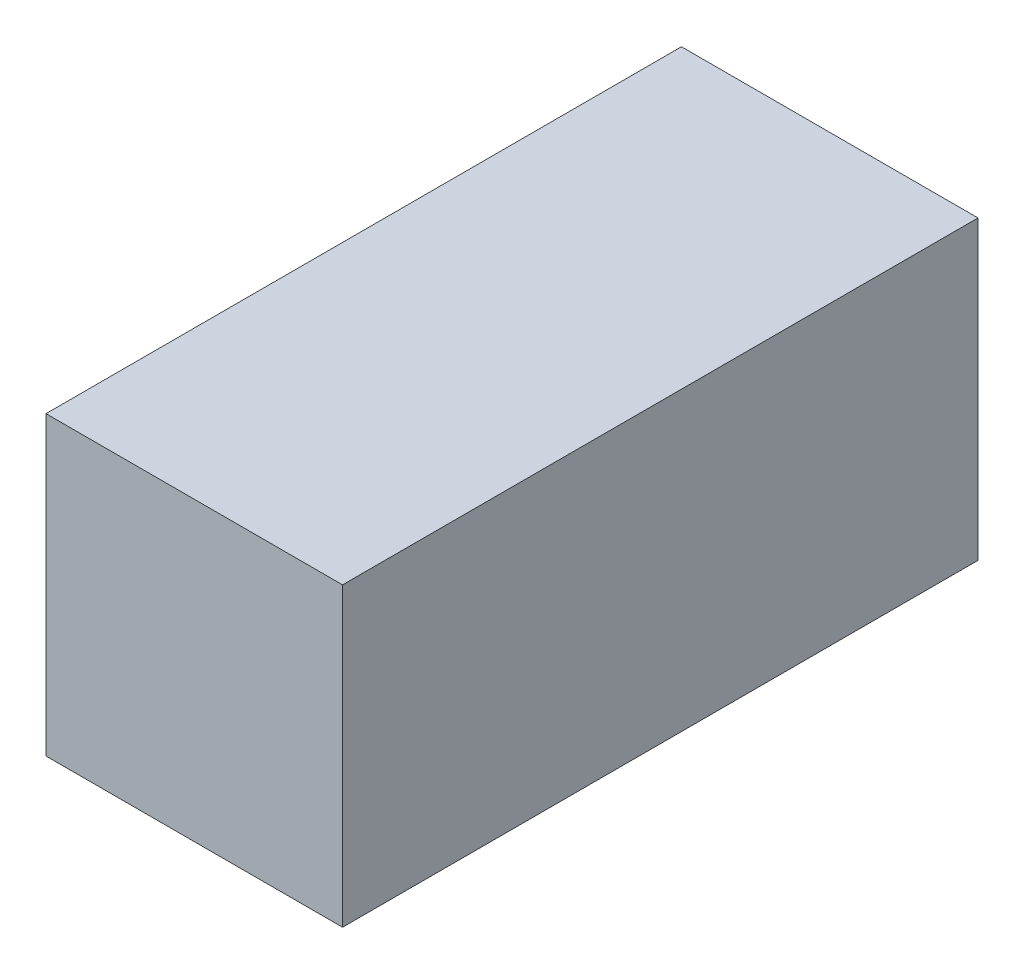
ISO-10303-21;
HEADER;
FILE_DESCRIPTION(('STEP AP214'),'2;1');
FILE_NAME('part.step','',(''),(''),'','','');
FILE_SCHEMA(('AUTOMOTIVE_DESIGN { 1 0 10303 214 1 1 1 1 }'));
ENDSEC;
DATA;
#1=APPLICATION_CONTEXT('core data for automotive mechanical design processes');
#2=APPLICATION_PROTOCOL_DEFINITION('international standard','automotive_design',2000,#1);
#3=PRODUCT_CONTEXT('',#1,'mechanical');
#4=PRODUCT('Part','Part','',(#3));
#5=PRODUCT_RELATED_PRODUCT_CATEGORY('part','',(#4));
#6=PRODUCT_DEFINITION_FORMATION('','',#4);
#7=PRODUCT_DEFINITION_CONTEXT('part definition',#1,'design');
#8=PRODUCT_DEFINITION('design','',#6,#7);
#9=PRODUCT_DEFINITION_SHAPE('','',#8);
#10=(LENGTH_UNIT() NAMED_UNIT(*) SI_UNIT(.MILLI.,.METRE.));
#11=(NAMED_UNIT(*) PLANE_ANGLE_UNIT() SI_UNIT($,.RADIAN.));
#12=(NAMED_UNIT(*) SI_UNIT($,.STERADIAN.) SOLID_ANGLE_UNIT());
#13=UNCERTAINTY_MEASURE_WITH_UNIT(LENGTH_MEASURE(1.E-05),#10,'distance_accuracy_value','');
#14=(GEOMETRIC_REPRESENTATION_CONTEXT(3) GLOBAL_UNCERTAINTY_ASSIGNED_CONTEXT((#13)) GLOBAL_UNIT_ASSIGNED_CONTEXT((#10,
#11,#12)) REPRESENTATION_CONTEXT('',''));
#15=CARTESIAN_POINT('',(0.,0.,0.));
#16=DIRECTION('',(0.,0.,1.));
#17=DIRECTION('',(1.,0.,0.));
#18=AXIS2_PLACEMENT_3D('',#15,#16,#17);
#19=CARTESIAN_POINT('',(22.225,22.225,95.25));
#20=DIRECTION('',(-1.,0.,0.));
#21=DIRECTION('',(0.,-1.,0.));
#22=AXIS2_PLACEMENT_3D('',#19,#20,#21);
#23=PLANE('',#22);
#24=DIRECTION('',(0.,1.,0.));
#25=VECTOR('',#24,1.);
#26=CARTESIAN_POINT('',(22.225,22.225,0.));
#27=LINE('',#26,#25);
#28=CARTESIAN_POINT('',(22.225,-22.225,0.));
#29=VERTEX_POINT('',#28);
#30=CARTESIAN_POINT('',(22.225,22.225,0.));
#31=VERTEX_POINT('',#30);
#32=EDGE_CURVE('E101',#29,#31,#27,.T.);
#33=ORIENTED_EDGE('',*,*,#32,.T.);
#34=DIRECTION('',(0.,0.,-1.));
#35=VECTOR('',#34,1.);
#36=CARTESIAN_POINT('',(22.225,22.225,95.25));
#37=LINE('',#36,#35);
#38=CARTESIAN_POINT('',(22.225,22.225,95.25));
#39=VERTEX_POINT('',#38);
#40=EDGE_CURVE('E11',#39,#31,#37,.T.);
#41=ORIENTED_EDGE('',*,*,#40,.F.);
#42=DIRECTION('',(0.,1.,0.));
#43=VECTOR('',#42,1.);
#44=CARTESIAN_POINT('',(22.225,22.225,95.25));
#45=LINE('',#44,#43);
#46=CARTESIAN_POINT('',(22.225,-22.225,95.25));
#47=VERTEX_POINT('',#46);
#48=EDGE_CURVE('E89',#47,#39,#45,.T.);
#49=ORIENTED_EDGE('',*,*,#48,.F.);
#50=DIRECTION('',(0.,0.,-1.));
#51=VECTOR('',#50,1.);
#52=CARTESIAN_POINT('',(22.225,-22.225,95.25));
#53=LINE('',#52,#51);
#54=EDGE_CURVE('E97',#47,#29,#53,.T.);
#55=ORIENTED_EDGE('',*,*,#54,.T.);
#56=EDGE_LOOP('',(#33,#41,#49,#55));
#57=FACE_BOUND('',#56,.T.);
#58=ADVANCED_FACE('F38',(#57),#23,.F.);
#59=CARTESIAN_POINT('',(-22.225,22.225,95.25));
#60=DIRECTION('',(0.,-1.,0.));
#61=DIRECTION('',(0.,0.,-1.));
#62=AXIS2_PLACEMENT_3D('',#59,#60,#61);
#63=PLANE('',#62);
#64=DIRECTION('',(-1.,0.,0.));
#65=VECTOR('',#64,1.);
#66=CARTESIAN_POINT('',(-22.225,22.225,0.));
#67=LINE('',#66,#65);
#68=CARTESIAN_POINT('',(-22.225,22.225,0.));
#69=VERTEX_POINT('',#68);
#70=EDGE_CURVE('E93',#31,#69,#67,.T.);
#71=ORIENTED_EDGE('',*,*,#70,.T.);
#72=DIRECTION('',(0.,0.,-1.));
#73=VECTOR('',#72,1.);
#74=CARTESIAN_POINT('',(-22.225,22.225,95.25));
#75=LINE('',#74,#73);
#76=CARTESIAN_POINT('',(-22.225,22.225,95.25));
#77=VERTEX_POINT('',#76);
#78=EDGE_CURVE('E46',#77,#69,#75,.T.);
#79=ORIENTED_EDGE('',*,*,#78,.F.);
#80=DIRECTION('',(-1.,0.,0.));
#81=VECTOR('',#80,1.);
#82=CARTESIAN_POINT('',(-22.225,22.225,95.25));
#83=LINE('',#82,#81);
#84=EDGE_CURVE('E84',#39,#77,#83,.T.);
#85=ORIENTED_EDGE('',*,*,#84,.F.);
#86=ORIENTED_EDGE('',*,*,#40,.T.);
#87=EDGE_LOOP('',(#71,#79,#85,#86));
#88=FACE_BOUND('',#87,.T.);
#89=ADVANCED_FACE('F92',(#88),#63,.F.);
#90=CARTESIAN_POINT('',(-22.225,22.225,95.25));
#91=DIRECTION('',(1.,0.,0.));
#92=DIRECTION('',(0.,1.,0.));
#93=AXIS2_PLACEMENT_3D('',#90,#91,#92);
#94=PLANE('',#93);
#95=DIRECTION('',(0.,-1.,0.));
#96=VECTOR('',#95,1.);
#97=CARTESIAN_POINT('',(-22.225,22.225,0.));
#98=LINE('',#97,#96);
#99=CARTESIAN_POINT('',(-22.225,-22.225,0.));
#100=VERTEX_POINT('',#99);
#101=EDGE_CURVE('E71',#69,#100,#98,.T.);
#102=ORIENTED_EDGE('',*,*,#101,.T.);
#103=DIRECTION('',(0.,0.,-1.));
#104=VECTOR('',#103,1.);
#105=CARTESIAN_POINT('',(-22.225,-22.225,95.25));
#106=LINE('',#105,#104);
#107=CARTESIAN_POINT('',(-22.225,-22.225,95.25));
#108=VERTEX_POINT('',#107);
#109=EDGE_CURVE('E94',#108,#100,#106,.T.);
#110=ORIENTED_EDGE('',*,*,#109,.F.);
#111=DIRECTION('',(0.,-1.,0.));
#112=VECTOR('',#111,1.);
#113=CARTESIAN_POINT('',(-22.225,22.225,95.25));
#114=LINE('',#113,#112);
#115=EDGE_CURVE('E87',#77,#108,#114,.T.);
#116=ORIENTED_EDGE('',*,*,#115,.F.);
#117=ORIENTED_EDGE('',*,*,#78,.T.);
#118=EDGE_LOOP('',(#102,#110,#116,#117));
#119=FACE_BOUND('',#118,.T.);
#120=ADVANCED_FACE('F95',(#119),#94,.F.);
#121=CARTESIAN_POINT('',(-22.225,-22.225,95.25));
#122=DIRECTION('',(0.,1.,0.));
#123=DIRECTION('',(0.,0.,1.));
#124=AXIS2_PLACEMENT_3D('',#121,#122,#123);
#125=PLANE('',#124);
#126=DIRECTION('',(1.,0.,0.));
#127=VECTOR('',#126,1.);
#128=CARTESIAN_POINT('',(-22.225,-22.225,0.));
#129=LINE('',#128,#127);
#130=EDGE_CURVE('E77',#100,#29,#129,.T.);
#131=ORIENTED_EDGE('',*,*,#130,.T.);
#132=ORIENTED_EDGE('',*,*,#54,.F.);
#133=DIRECTION('',(1.,0.,0.));
#134=VECTOR('',#133,1.);
#135=CARTESIAN_POINT('',(-22.225,-22.225,95.25));
#136=LINE('',#135,#134);
#137=EDGE_CURVE('E54',#108,#47,#136,.T.);
#138=ORIENTED_EDGE('',*,*,#137,.F.);
#139=ORIENTED_EDGE('',*,*,#109,.T.);
#140=EDGE_LOOP('',(#131,#132,#138,#139));
#141=FACE_BOUND('',#140,.T.);
#142=ADVANCED_FACE('F108',(#141),#125,.F.);
#143=CARTESIAN_POINT('',(0.,0.,95.25));
#144=DIRECTION('',(0.,0.,1.));
#145=DIRECTION('',(1.,0.,0.));
#146=AXIS2_PLACEMENT_3D('',#143,#144,#145);
#147=PLANE('',#146);
#148=ORIENTED_EDGE('',*,*,#48,.T.);
#149=ORIENTED_EDGE('',*,*,#84,.T.);
#150=ORIENTED_EDGE('',*,*,#115,.T.);
#151=ORIENTED_EDGE('',*,*,#137,.T.);
#152=EDGE_LOOP('',(#148,#149,#150,#151));
#153=FACE_BOUND('',#152,.T.);
#154=ADVANCED_FACE('F85',(#153),#147,.T.);
#155=CARTESIAN_POINT('',(0.,0.,0.));
#156=DIRECTION('',(0.,0.,1.));
#157=DIRECTION('',(1.,0.,0.));
#158=AXIS2_PLACEMENT_3D('',#155,#156,#157);
#159=PLANE('',#158);
#160=ORIENTED_EDGE('',*,*,#32,.F.);
#161=ORIENTED_EDGE('',*,*,#130,.F.);
#162=ORIENTED_EDGE('',*,*,#101,.F.);
#163=ORIENTED_EDGE('',*,*,#70,.F.);
#164=EDGE_LOOP('',(#160,#161,#162,#163));
#165=FACE_BOUND('',#164,.T.);
#166=ADVANCED_FACE('F111',(#165),#159,.F.);
#167=CLOSED_SHELL('',(#58,#89,#120,#142,#154,#166));
#168=MANIFOLD_SOLID_BREP('B2',#167);
#169=ADVANCED_BREP_SHAPE_REPRESENTATION('',(#18,#168),#14);
#170=SHAPE_DEFINITION_REPRESENTATION(#9,#169);
ENDSEC;
END-ISO-10303-21;
